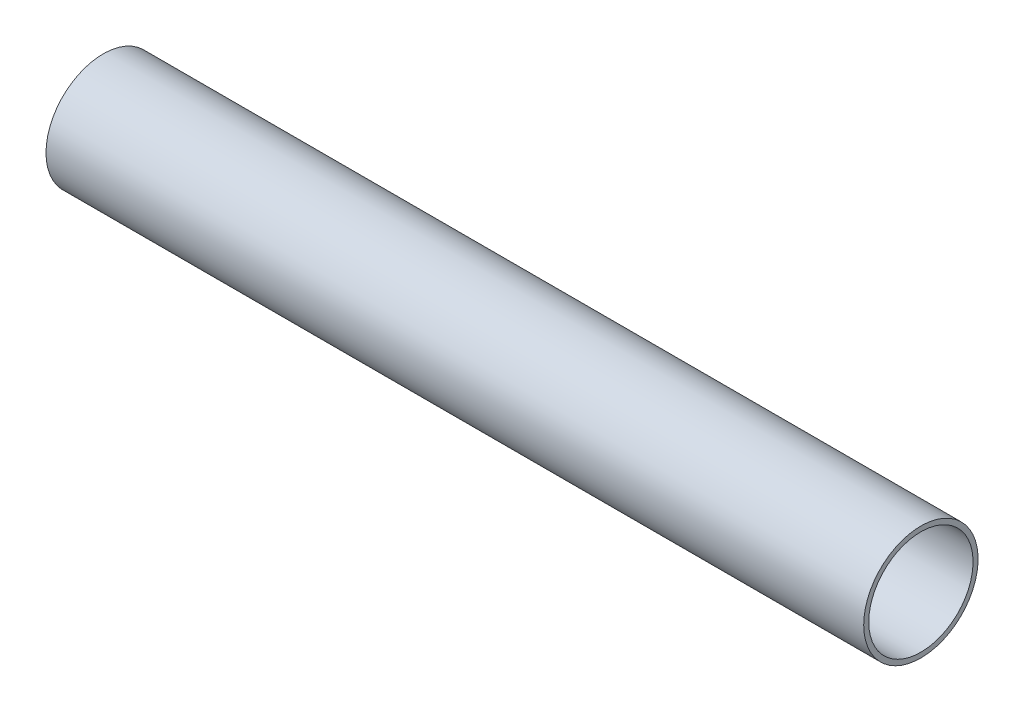
ISO-10303-21;
HEADER;
FILE_DESCRIPTION(('STEP AP214'),'2;1');
FILE_NAME('part.step','',(''),(''),'','','');
FILE_SCHEMA(('AUTOMOTIVE_DESIGN { 1 0 10303 214 1 1 1 1 }'));
ENDSEC;
DATA;
#1=APPLICATION_CONTEXT('core data for automotive mechanical design processes');
#2=APPLICATION_PROTOCOL_DEFINITION('international standard','automotive_design',2000,#1);
#3=PRODUCT_CONTEXT('',#1,'mechanical');
#4=PRODUCT('Part','Part','',(#3));
#5=PRODUCT_RELATED_PRODUCT_CATEGORY('part','',(#4));
#6=PRODUCT_DEFINITION_FORMATION('','',#4);
#7=PRODUCT_DEFINITION_CONTEXT('part definition',#1,'design');
#8=PRODUCT_DEFINITION('design','',#6,#7);
#9=PRODUCT_DEFINITION_SHAPE('','',#8);
#10=(LENGTH_UNIT() NAMED_UNIT(*) SI_UNIT(.MILLI.,.METRE.));
#11=(NAMED_UNIT(*) PLANE_ANGLE_UNIT() SI_UNIT($,.RADIAN.));
#12=(NAMED_UNIT(*) SI_UNIT($,.STERADIAN.) SOLID_ANGLE_UNIT());
#13=UNCERTAINTY_MEASURE_WITH_UNIT(LENGTH_MEASURE(1.E-05),#10,'distance_accuracy_value','');
#14=(GEOMETRIC_REPRESENTATION_CONTEXT(3) GLOBAL_UNCERTAINTY_ASSIGNED_CONTEXT((#13)) GLOBAL_UNIT_ASSIGNED_CONTEXT((#10,
#11,#12)) REPRESENTATION_CONTEXT('',''));
#15=CARTESIAN_POINT('',(0.,0.,0.));
#16=DIRECTION('',(0.,0.,1.));
#17=DIRECTION('',(1.,0.,0.));
#18=AXIS2_PLACEMENT_3D('',#15,#16,#17);
#19=CARTESIAN_POINT('',(0.,-15.5,0.));
#20=DIRECTION('',(-1.,0.,0.));
#21=DIRECTION('',(0.,0.,1.));
#22=AXIS2_PLACEMENT_3D('',#19,#20,#21);
#23=PLANE('',#22);
#24=CARTESIAN_POINT('',(0.,0.,0.));
#25=DIRECTION('',(-1.,0.,0.));
#26=DIRECTION('',(0.,0.,1.));
#27=AXIS2_PLACEMENT_3D('',#24,#25,#26);
#28=CIRCLE('',#27,17.);
#29=CARTESIAN_POINT('',(0.,0.,17.));
#30=VERTEX_POINT('',#29);
#31=EDGE_CURVE('E10',#30,#30,#28,.T.);
#32=ORIENTED_EDGE('',*,*,#31,.T.);
#33=EDGE_LOOP('',(#32));
#34=FACE_BOUND('',#33,.T.);
#35=CARTESIAN_POINT('',(0.,0.,0.));
#36=DIRECTION('',(-1.,0.,0.));
#37=DIRECTION('',(0.,0.,1.));
#38=AXIS2_PLACEMENT_3D('',#35,#36,#37);
#39=CIRCLE('',#38,15.5);
#40=CARTESIAN_POINT('',(0.,0.,15.5));
#41=VERTEX_POINT('',#40);
#42=EDGE_CURVE('E45',#41,#41,#39,.T.);
#43=ORIENTED_EDGE('',*,*,#42,.F.);
#44=EDGE_LOOP('',(#43));
#45=FACE_BOUND('',#44,.T.);
#46=ADVANCED_FACE('F31',(#34,#45),#23,.T.);
#47=CARTESIAN_POINT('',(0.,0.,0.));
#48=DIRECTION('',(-1.,0.,0.));
#49=DIRECTION('',(0.,0.,1.));
#50=AXIS2_PLACEMENT_3D('',#47,#48,#49);
#51=CYLINDRICAL_SURFACE('',#50,17.);
#52=CARTESIAN_POINT('',(243.,0.,0.));
#53=DIRECTION('',(-1.,0.,0.));
#54=DIRECTION('',(0.,0.,1.));
#55=AXIS2_PLACEMENT_3D('',#52,#53,#54);
#56=CIRCLE('',#55,17.);
#57=CARTESIAN_POINT('',(243.,0.,17.));
#58=VERTEX_POINT('',#57);
#59=EDGE_CURVE('E37',#58,#58,#56,.T.);
#60=ORIENTED_EDGE('',*,*,#59,.T.);
#61=EDGE_LOOP('',(#60));
#62=FACE_BOUND('',#61,.T.);
#63=ORIENTED_EDGE('',*,*,#31,.F.);
#64=EDGE_LOOP('',(#63));
#65=FACE_BOUND('',#64,.T.);
#66=ADVANCED_FACE('F55',(#62,#65),#51,.T.);
#67=CARTESIAN_POINT('',(243.,-15.5,0.));
#68=DIRECTION('',(1.,0.,0.));
#69=DIRECTION('',(0.,0.,-1.));
#70=AXIS2_PLACEMENT_3D('',#67,#68,#69);
#71=PLANE('',#70);
#72=CARTESIAN_POINT('',(243.,0.,0.));
#73=DIRECTION('',(-1.,0.,0.));
#74=DIRECTION('',(0.,0.,1.));
#75=AXIS2_PLACEMENT_3D('',#72,#73,#74);
#76=CIRCLE('',#75,15.5);
#77=CARTESIAN_POINT('',(243.,0.,15.5));
#78=VERTEX_POINT('',#77);
#79=EDGE_CURVE('E41',#78,#78,#76,.T.);
#80=ORIENTED_EDGE('',*,*,#79,.T.);
#81=EDGE_LOOP('',(#80));
#82=FACE_BOUND('',#81,.T.);
#83=ORIENTED_EDGE('',*,*,#59,.F.);
#84=EDGE_LOOP('',(#83));
#85=FACE_BOUND('',#84,.T.);
#86=ADVANCED_FACE('F59',(#82,#85),#71,.T.);
#87=CARTESIAN_POINT('',(0.,0.,0.));
#88=DIRECTION('',(-1.,0.,0.));
#89=DIRECTION('',(0.,0.,1.));
#90=AXIS2_PLACEMENT_3D('',#87,#88,#89);
#91=CYLINDRICAL_SURFACE('',#90,15.5);
#92=ORIENTED_EDGE('',*,*,#42,.T.);
#93=EDGE_LOOP('',(#92));
#94=FACE_BOUND('',#93,.T.);
#95=ORIENTED_EDGE('',*,*,#79,.F.);
#96=EDGE_LOOP('',(#95));
#97=FACE_BOUND('',#96,.T.);
#98=ADVANCED_FACE('F51',(#94,#97),#91,.F.);
#99=CLOSED_SHELL('',(#46,#66,#86,#98));
#100=MANIFOLD_SOLID_BREP('B2',#99);
#101=ADVANCED_BREP_SHAPE_REPRESENTATION('',(#18,#100),#14);
#102=SHAPE_DEFINITION_REPRESENTATION(#9,#101);
ENDSEC;
END-ISO-10303-21;
